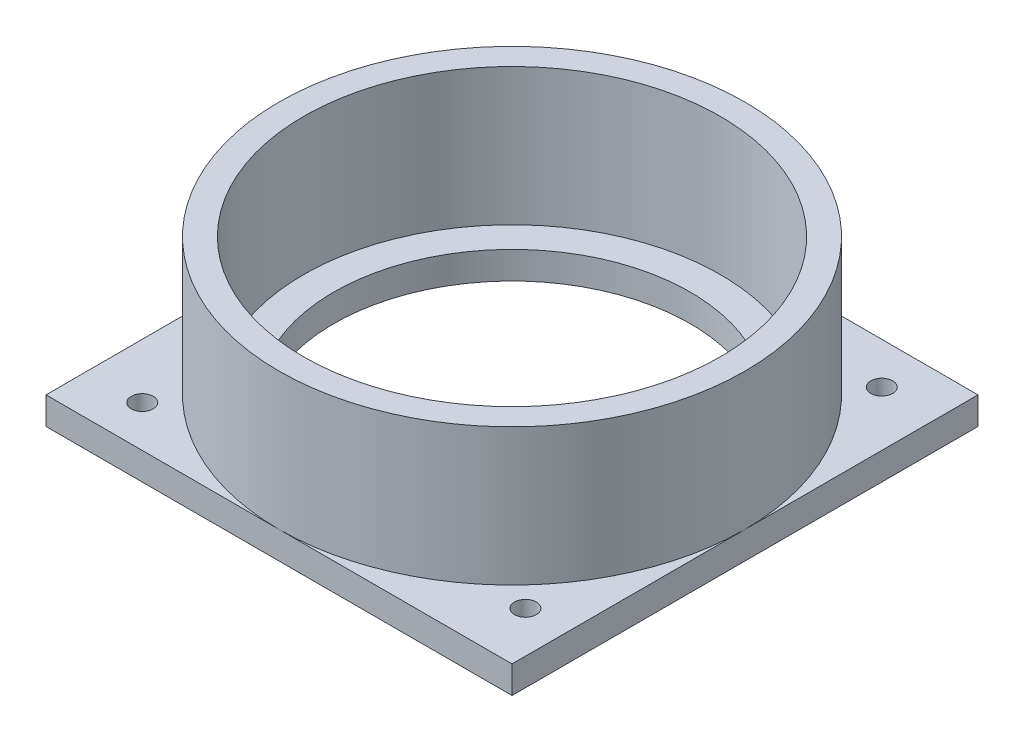
ISO-10303-21;
HEADER;
FILE_DESCRIPTION(('STEP AP214'),'2;1');
FILE_NAME('part.step','',(''),(''),'','','');
FILE_SCHEMA(('AUTOMOTIVE_DESIGN { 1 0 10303 214 1 1 1 1 }'));
ENDSEC;
DATA;
#1=APPLICATION_CONTEXT('core data for automotive mechanical design processes');
#2=APPLICATION_PROTOCOL_DEFINITION('international standard','automotive_design',2000,#1);
#3=PRODUCT_CONTEXT('',#1,'mechanical');
#4=PRODUCT('Part','Part','',(#3));
#5=PRODUCT_RELATED_PRODUCT_CATEGORY('part','',(#4));
#6=PRODUCT_DEFINITION_FORMATION('','',#4);
#7=PRODUCT_DEFINITION_CONTEXT('part definition',#1,'design');
#8=PRODUCT_DEFINITION('design','',#6,#7);
#9=PRODUCT_DEFINITION_SHAPE('','',#8);
#10=(LENGTH_UNIT() NAMED_UNIT(*) SI_UNIT(.MILLI.,.METRE.));
#11=(NAMED_UNIT(*) PLANE_ANGLE_UNIT() SI_UNIT($,.RADIAN.));
#12=(NAMED_UNIT(*) SI_UNIT($,.STERADIAN.) SOLID_ANGLE_UNIT());
#13=UNCERTAINTY_MEASURE_WITH_UNIT(LENGTH_MEASURE(1.E-05),#10,'distance_accuracy_value','');
#14=(GEOMETRIC_REPRESENTATION_CONTEXT(3) GLOBAL_UNCERTAINTY_ASSIGNED_CONTEXT((#13)) GLOBAL_UNIT_ASSIGNED_CONTEXT((#10,
#11,#12)) REPRESENTATION_CONTEXT('',''));
#15=CARTESIAN_POINT('',(0.,0.,0.));
#16=DIRECTION('',(0.,0.,1.));
#17=DIRECTION('',(1.,0.,0.));
#18=AXIS2_PLACEMENT_3D('',#15,#16,#17);
#19=CARTESIAN_POINT('',(0.,5.,0.));
#20=DIRECTION('',(0.,1.,0.));
#21=DIRECTION('',(0.,0.,1.));
#22=AXIS2_PLACEMENT_3D('',#19,#20,#21);
#23=PLANE('',#22);
#24=CARTESIAN_POINT('',(34.9430639376307,5.,32.5000000000003));
#25=DIRECTION('',(0.,1.,0.));
#26=DIRECTION('',(0.,0.,1.));
#27=AXIS2_PLACEMENT_3D('',#24,#25,#26);
#28=CIRCLE('',#27,2.00000000000173);
#29=CARTESIAN_POINT('',(34.9430639376307,5.,34.500000000002));
#30=VERTEX_POINT('',#29);
#31=EDGE_CURVE('E167',#30,#30,#28,.T.);
#32=ORIENTED_EDGE('',*,*,#31,.F.);
#33=EDGE_LOOP('',(#32));
#34=FACE_BOUND('',#33,.T.);
#35=CARTESIAN_POINT('',(0.,5.,0.));
#36=DIRECTION('',(0.,1.,0.));
#37=DIRECTION('',(0.,0.,1.));
#38=AXIS2_PLACEMENT_3D('',#35,#36,#37);
#39=CIRCLE('',#38,42.5);
#40=CARTESIAN_POINT('',(0.,5.,42.5));
#41=VERTEX_POINT('',#40);
#42=CARTESIAN_POINT('',(42.5,5.,0.));
#43=VERTEX_POINT('',#42);
#44=EDGE_CURVE('E44',#41,#43,#39,.T.);
#45=ORIENTED_EDGE('',*,*,#44,.F.);
#46=DIRECTION('',(1.,0.,0.));
#47=VECTOR('',#46,1.);
#48=CARTESIAN_POINT('',(-42.5,5.,42.5));
#49=LINE('',#48,#47);
#50=CARTESIAN_POINT('',(42.5,5.,42.5));
#51=VERTEX_POINT('',#50);
#52=EDGE_CURVE('E95',#41,#51,#49,.T.);
#53=ORIENTED_EDGE('',*,*,#52,.T.);
#54=DIRECTION('',(0.,0.,-1.));
#55=VECTOR('',#54,1.);
#56=CARTESIAN_POINT('',(42.5,5.,-42.5));
#57=LINE('',#56,#55);
#58=EDGE_CURVE('E106',#51,#43,#57,.T.);
#59=ORIENTED_EDGE('',*,*,#58,.T.);
#60=EDGE_LOOP('',(#45,#53,#59));
#61=FACE_BOUND('',#60,.T.);
#62=ADVANCED_FACE('F33',(#34,#61),#23,.T.);
#63=CARTESIAN_POINT('',(32.5000000000022,5.,-34.9430639376308));
#64=DIRECTION('',(0.,1.,0.));
#65=DIRECTION('',(0.,0.,1.));
#66=AXIS2_PLACEMENT_3D('',#63,#64,#65);
#67=CIRCLE('',#66,2.00000000000105);
#68=CARTESIAN_POINT('',(32.5000000000022,5.,-32.9430639376298));
#69=VERTEX_POINT('',#68);
#70=EDGE_CURVE('E149',#69,#69,#67,.T.);
#71=ORIENTED_EDGE('',*,*,#70,.F.);
#72=EDGE_LOOP('',(#71));
#73=FACE_BOUND('',#72,.T.);
#74=CARTESIAN_POINT('',(0.,5.,-42.5));
#75=VERTEX_POINT('',#74);
#76=EDGE_CURVE('E11',#43,#75,#39,.T.);
#77=ORIENTED_EDGE('',*,*,#76,.F.);
#78=CARTESIAN_POINT('',(42.5,5.,-42.5));
#79=VERTEX_POINT('',#78);
#80=EDGE_CURVE('E127',#43,#79,#57,.T.);
#81=ORIENTED_EDGE('',*,*,#80,.T.);
#82=DIRECTION('',(-1.,0.,0.));
#83=VECTOR('',#82,1.);
#84=CARTESIAN_POINT('',(-42.5,5.,-42.5));
#85=LINE('',#84,#83);
#86=EDGE_CURVE('E128',#79,#75,#85,.T.);
#87=ORIENTED_EDGE('',*,*,#86,.T.);
#88=EDGE_LOOP('',(#77,#81,#87));
#89=FACE_BOUND('',#88,.T.);
#90=ADVANCED_FACE('F194',(#73,#89),#23,.T.);
#91=CARTESIAN_POINT('',(-34.9430639376289,5.,-32.5000000000023));
#92=DIRECTION('',(0.,1.,0.));
#93=DIRECTION('',(0.,0.,1.));
#94=AXIS2_PLACEMENT_3D('',#91,#92,#93);
#95=CIRCLE('',#94,1.99999999999906);
#96=CARTESIAN_POINT('',(-34.9430639376289,5.,-30.5000000000032));
#97=VERTEX_POINT('',#96);
#98=EDGE_CURVE('E168',#97,#97,#95,.T.);
#99=ORIENTED_EDGE('',*,*,#98,.F.);
#100=EDGE_LOOP('',(#99));
#101=FACE_BOUND('',#100,.T.);
#102=CARTESIAN_POINT('',(-42.5,5.,0.));
#103=VERTEX_POINT('',#102);
#104=EDGE_CURVE('E42',#75,#103,#39,.T.);
#105=ORIENTED_EDGE('',*,*,#104,.F.);
#106=CARTESIAN_POINT('',(-42.5,5.,-42.5));
#107=VERTEX_POINT('',#106);
#108=EDGE_CURVE('E126',#75,#107,#85,.T.);
#109=ORIENTED_EDGE('',*,*,#108,.T.);
#110=DIRECTION('',(0.,0.,1.));
#111=VECTOR('',#110,1.);
#112=CARTESIAN_POINT('',(-42.5,5.,-42.5));
#113=LINE('',#112,#111);
#114=EDGE_CURVE('E104',#107,#103,#113,.T.);
#115=ORIENTED_EDGE('',*,*,#114,.T.);
#116=EDGE_LOOP('',(#105,#109,#115));
#117=FACE_BOUND('',#116,.T.);
#118=ADVANCED_FACE('F197',(#101,#117),#23,.T.);
#119=CARTESIAN_POINT('',(0.,5.,0.));
#120=DIRECTION('',(0.,1.,0.));
#121=DIRECTION('',(0.,0.,1.));
#122=AXIS2_PLACEMENT_3D('',#119,#120,#121);
#123=CIRCLE('',#122,32.5);
#124=CARTESIAN_POINT('',(0.,5.,32.5));
#125=VERTEX_POINT('',#124);
#126=EDGE_CURVE('E122',#125,#125,#123,.T.);
#127=ORIENTED_EDGE('',*,*,#126,.F.);
#128=EDGE_LOOP('',(#127));
#129=FACE_BOUND('',#128,.T.);
#130=CARTESIAN_POINT('',(0.,5.,0.));
#131=DIRECTION('',(0.,1.,0.));
#132=DIRECTION('',(0.,0.,1.));
#133=AXIS2_PLACEMENT_3D('',#130,#131,#132);
#134=CIRCLE('',#133,38.);
#135=CARTESIAN_POINT('',(0.,5.,38.));
#136=VERTEX_POINT('',#135);
#137=EDGE_CURVE('E156',#136,#136,#134,.T.);
#138=ORIENTED_EDGE('',*,*,#137,.T.);
#139=EDGE_LOOP('',(#138));
#140=FACE_BOUND('',#139,.T.);
#141=ADVANCED_FACE('F183',(#129,#140),#23,.T.);
#142=CARTESIAN_POINT('',(42.5,5.,-42.5));
#143=DIRECTION('',(-1.,0.,0.));
#144=DIRECTION('',(0.,0.,1.));
#145=AXIS2_PLACEMENT_3D('',#142,#143,#144);
#146=PLANE('',#145);
#147=DIRECTION('',(0.,0.,-1.));
#148=VECTOR('',#147,1.);
#149=CARTESIAN_POINT('',(42.5,0.,-42.5));
#150=LINE('',#149,#148);
#151=CARTESIAN_POINT('',(42.5,0.,42.5));
#152=VERTEX_POINT('',#151);
#153=CARTESIAN_POINT('',(42.5,0.,-42.5));
#154=VERTEX_POINT('',#153);
#155=EDGE_CURVE('E121',#152,#154,#150,.T.);
#156=ORIENTED_EDGE('',*,*,#155,.T.);
#157=DIRECTION('',(0.,-1.,0.));
#158=VECTOR('',#157,1.);
#159=CARTESIAN_POINT('',(42.5,5.,-42.5));
#160=LINE('',#159,#158);
#161=EDGE_CURVE('E111',#79,#154,#160,.T.);
#162=ORIENTED_EDGE('',*,*,#161,.F.);
#163=ORIENTED_EDGE('',*,*,#80,.F.);
#164=ORIENTED_EDGE('',*,*,#58,.F.);
#165=DIRECTION('',(0.,-1.,0.));
#166=VECTOR('',#165,1.);
#167=CARTESIAN_POINT('',(42.5,5.,42.5));
#168=LINE('',#167,#166);
#169=EDGE_CURVE('E94',#51,#152,#168,.T.);
#170=ORIENTED_EDGE('',*,*,#169,.T.);
#171=EDGE_LOOP('',(#156,#162,#163,#164,#170));
#172=FACE_BOUND('',#171,.T.);
#173=ADVANCED_FACE('F35',(#172),#146,.F.);
#174=CARTESIAN_POINT('',(-42.5,5.,-42.5));
#175=DIRECTION('',(0.,0.,1.));
#176=DIRECTION('',(1.,0.,0.));
#177=AXIS2_PLACEMENT_3D('',#174,#175,#176);
#178=PLANE('',#177);
#179=DIRECTION('',(-1.,0.,0.));
#180=VECTOR('',#179,1.);
#181=CARTESIAN_POINT('',(-42.5,0.,-42.5));
#182=LINE('',#181,#180);
#183=CARTESIAN_POINT('',(-42.5,0.,-42.5));
#184=VERTEX_POINT('',#183);
#185=EDGE_CURVE('E134',#154,#184,#182,.T.);
#186=ORIENTED_EDGE('',*,*,#185,.T.);
#187=DIRECTION('',(0.,-1.,0.));
#188=VECTOR('',#187,1.);
#189=CARTESIAN_POINT('',(-42.5,5.,-42.5));
#190=LINE('',#189,#188);
#191=EDGE_CURVE('E113',#107,#184,#190,.T.);
#192=ORIENTED_EDGE('',*,*,#191,.F.);
#193=ORIENTED_EDGE('',*,*,#108,.F.);
#194=ORIENTED_EDGE('',*,*,#86,.F.);
#195=ORIENTED_EDGE('',*,*,#161,.T.);
#196=EDGE_LOOP('',(#186,#192,#193,#194,#195));
#197=FACE_BOUND('',#196,.T.);
#198=ADVANCED_FACE('F203',(#197),#178,.F.);
#199=CARTESIAN_POINT('',(-42.5,5.,-42.5));
#200=DIRECTION('',(1.,0.,0.));
#201=DIRECTION('',(0.,0.,-1.));
#202=AXIS2_PLACEMENT_3D('',#199,#200,#201);
#203=PLANE('',#202);
#204=DIRECTION('',(0.,0.,1.));
#205=VECTOR('',#204,1.);
#206=CARTESIAN_POINT('',(-42.5,0.,-42.5));
#207=LINE('',#206,#205);
#208=CARTESIAN_POINT('',(-42.5,0.,42.5));
#209=VERTEX_POINT('',#208);
#210=EDGE_CURVE('E136',#184,#209,#207,.T.);
#211=ORIENTED_EDGE('',*,*,#210,.T.);
#212=DIRECTION('',(0.,-1.,0.));
#213=VECTOR('',#212,1.);
#214=CARTESIAN_POINT('',(-42.5,5.,42.5));
#215=LINE('',#214,#213);
#216=CARTESIAN_POINT('',(-42.5,5.,42.5));
#217=VERTEX_POINT('',#216);
#218=EDGE_CURVE('E141',#217,#209,#215,.T.);
#219=ORIENTED_EDGE('',*,*,#218,.F.);
#220=EDGE_CURVE('E90',#103,#217,#113,.T.);
#221=ORIENTED_EDGE('',*,*,#220,.F.);
#222=ORIENTED_EDGE('',*,*,#114,.F.);
#223=ORIENTED_EDGE('',*,*,#191,.T.);
#224=EDGE_LOOP('',(#211,#219,#221,#222,#223));
#225=FACE_BOUND('',#224,.T.);
#226=ADVANCED_FACE('F190',(#225),#203,.F.);
#227=CARTESIAN_POINT('',(-42.5,5.,42.5));
#228=DIRECTION('',(0.,0.,-1.));
#229=DIRECTION('',(-1.,0.,0.));
#230=AXIS2_PLACEMENT_3D('',#227,#228,#229);
#231=PLANE('',#230);
#232=DIRECTION('',(1.,0.,0.));
#233=VECTOR('',#232,1.);
#234=CARTESIAN_POINT('',(-42.5,0.,42.5));
#235=LINE('',#234,#233);
#236=EDGE_CURVE('E138',#209,#152,#235,.T.);
#237=ORIENTED_EDGE('',*,*,#236,.T.);
#238=ORIENTED_EDGE('',*,*,#169,.F.);
#239=ORIENTED_EDGE('',*,*,#52,.F.);
#240=EDGE_CURVE('E87',#217,#41,#49,.T.);
#241=ORIENTED_EDGE('',*,*,#240,.F.);
#242=ORIENTED_EDGE('',*,*,#218,.T.);
#243=EDGE_LOOP('',(#237,#238,#239,#241,#242));
#244=FACE_BOUND('',#243,.T.);
#245=ADVANCED_FACE('F99',(#244),#231,.F.);
#246=CARTESIAN_POINT('',(-32.5000000000004,5.,34.9430639376288));
#247=DIRECTION('',(0.,1.,0.));
#248=DIRECTION('',(0.,0.,1.));
#249=AXIS2_PLACEMENT_3D('',#246,#247,#248);
#250=CIRCLE('',#249,2.);
#251=CARTESIAN_POINT('',(-32.5000000000004,5.,36.9430639376288));
#252=VERTEX_POINT('',#251);
#253=EDGE_CURVE('E171',#252,#252,#250,.T.);
#254=ORIENTED_EDGE('',*,*,#253,.F.);
#255=EDGE_LOOP('',(#254));
#256=FACE_BOUND('',#255,.T.);
#257=EDGE_CURVE('E51',#103,#41,#39,.T.);
#258=ORIENTED_EDGE('',*,*,#257,.F.);
#259=ORIENTED_EDGE('',*,*,#220,.T.);
#260=ORIENTED_EDGE('',*,*,#240,.T.);
#261=EDGE_LOOP('',(#258,#259,#260));
#262=FACE_BOUND('',#261,.T.);
#263=ADVANCED_FACE('F89',(#256,#262),#23,.T.);
#264=CARTESIAN_POINT('',(0.,0.,0.));
#265=DIRECTION('',(0.,1.,0.));
#266=DIRECTION('',(0.,0.,1.));
#267=AXIS2_PLACEMENT_3D('',#264,#265,#266);
#268=PLANE('',#267);
#269=CARTESIAN_POINT('',(34.9430639376307,0.,32.5000000000003));
#270=DIRECTION('',(0.,1.,0.));
#271=DIRECTION('',(0.,0.,1.));
#272=AXIS2_PLACEMENT_3D('',#269,#270,#271);
#273=CIRCLE('',#272,2.00000000000173);
#274=CARTESIAN_POINT('',(34.9430639376307,0.,34.500000000002));
#275=VERTEX_POINT('',#274);
#276=EDGE_CURVE('E37',#275,#275,#273,.T.);
#277=ORIENTED_EDGE('',*,*,#276,.T.);
#278=EDGE_LOOP('',(#277));
#279=FACE_BOUND('',#278,.T.);
#280=CARTESIAN_POINT('',(-34.9430639376289,0.,-32.5000000000023));
#281=DIRECTION('',(0.,1.,0.));
#282=DIRECTION('',(0.,0.,1.));
#283=AXIS2_PLACEMENT_3D('',#280,#281,#282);
#284=CIRCLE('',#283,1.99999999999906);
#285=CARTESIAN_POINT('',(-34.9430639376289,0.,-30.5000000000032));
#286=VERTEX_POINT('',#285);
#287=EDGE_CURVE('E151',#286,#286,#284,.T.);
#288=ORIENTED_EDGE('',*,*,#287,.T.);
#289=EDGE_LOOP('',(#288));
#290=FACE_BOUND('',#289,.T.);
#291=CARTESIAN_POINT('',(-32.5000000000004,0.,34.9430639376288));
#292=DIRECTION('',(0.,1.,0.));
#293=DIRECTION('',(0.,0.,1.));
#294=AXIS2_PLACEMENT_3D('',#291,#292,#293);
#295=CIRCLE('',#294,2.);
#296=CARTESIAN_POINT('',(-32.5000000000004,0.,36.9430639376288));
#297=VERTEX_POINT('',#296);
#298=EDGE_CURVE('E148',#297,#297,#295,.T.);
#299=ORIENTED_EDGE('',*,*,#298,.T.);
#300=EDGE_LOOP('',(#299));
#301=FACE_BOUND('',#300,.T.);
#302=CARTESIAN_POINT('',(32.5000000000022,0.,-34.9430639376308));
#303=DIRECTION('',(0.,1.,0.));
#304=DIRECTION('',(0.,0.,1.));
#305=AXIS2_PLACEMENT_3D('',#302,#303,#304);
#306=CIRCLE('',#305,2.00000000000105);
#307=CARTESIAN_POINT('',(32.5000000000022,0.,-32.9430639376298));
#308=VERTEX_POINT('',#307);
#309=EDGE_CURVE('E145',#308,#308,#306,.T.);
#310=ORIENTED_EDGE('',*,*,#309,.T.);
#311=EDGE_LOOP('',(#310));
#312=FACE_BOUND('',#311,.T.);
#313=CARTESIAN_POINT('',(0.,0.,0.));
#314=DIRECTION('',(0.,1.,0.));
#315=DIRECTION('',(0.,0.,1.));
#316=AXIS2_PLACEMENT_3D('',#313,#314,#315);
#317=CIRCLE('',#316,32.5);
#318=CARTESIAN_POINT('',(0.,0.,32.5));
#319=VERTEX_POINT('',#318);
#320=EDGE_CURVE('E118',#319,#319,#317,.T.);
#321=ORIENTED_EDGE('',*,*,#320,.T.);
#322=EDGE_LOOP('',(#321));
#323=FACE_BOUND('',#322,.T.);
#324=ORIENTED_EDGE('',*,*,#155,.F.);
#325=ORIENTED_EDGE('',*,*,#236,.F.);
#326=ORIENTED_EDGE('',*,*,#210,.F.);
#327=ORIENTED_EDGE('',*,*,#185,.F.);
#328=EDGE_LOOP('',(#324,#325,#326,#327));
#329=FACE_BOUND('',#328,.T.);
#330=ADVANCED_FACE('F181',(#279,#290,#301,#312,#323,#329),#268,.F.);
#331=CARTESIAN_POINT('',(0.,0.,0.));
#332=DIRECTION('',(0.,1.,0.));
#333=DIRECTION('',(0.,0.,1.));
#334=AXIS2_PLACEMENT_3D('',#331,#332,#333);
#335=CYLINDRICAL_SURFACE('',#334,32.5);
#336=ORIENTED_EDGE('',*,*,#320,.F.);
#337=EDGE_LOOP('',(#336));
#338=FACE_BOUND('',#337,.T.);
#339=ORIENTED_EDGE('',*,*,#126,.T.);
#340=EDGE_LOOP('',(#339));
#341=FACE_BOUND('',#340,.T.);
#342=ADVANCED_FACE('F188',(#338,#341),#335,.F.);
#343=CARTESIAN_POINT('',(0.,30.,0.));
#344=DIRECTION('',(0.,1.,0.));
#345=DIRECTION('',(0.,0.,1.));
#346=AXIS2_PLACEMENT_3D('',#343,#344,#345);
#347=PLANE('',#346);
#348=CARTESIAN_POINT('',(0.,30.,0.));
#349=DIRECTION('',(0.,1.,0.));
#350=DIRECTION('',(0.,0.,1.));
#351=AXIS2_PLACEMENT_3D('',#348,#349,#350);
#352=CIRCLE('',#351,42.5);
#353=CARTESIAN_POINT('',(0.,30.,42.5));
#354=VERTEX_POINT('',#353);
#355=EDGE_CURVE('E108',#354,#354,#352,.T.);
#356=ORIENTED_EDGE('',*,*,#355,.T.);
#357=EDGE_LOOP('',(#356));
#358=FACE_BOUND('',#357,.T.);
#359=CARTESIAN_POINT('',(0.,30.,0.));
#360=DIRECTION('',(0.,1.,0.));
#361=DIRECTION('',(0.,0.,1.));
#362=AXIS2_PLACEMENT_3D('',#359,#360,#361);
#363=CIRCLE('',#362,38.);
#364=CARTESIAN_POINT('',(0.,30.,38.));
#365=VERTEX_POINT('',#364);
#366=EDGE_CURVE('E109',#365,#365,#363,.T.);
#367=ORIENTED_EDGE('',*,*,#366,.F.);
#368=EDGE_LOOP('',(#367));
#369=FACE_BOUND('',#368,.T.);
#370=ADVANCED_FACE('F209',(#358,#369),#347,.T.);
#371=CARTESIAN_POINT('',(0.,30.,0.));
#372=DIRECTION('',(0.,-1.,0.));
#373=DIRECTION('',(0.,0.,-1.));
#374=AXIS2_PLACEMENT_3D('',#371,#372,#373);
#375=CYLINDRICAL_SURFACE('',#374,42.5);
#376=ORIENTED_EDGE('',*,*,#355,.F.);
#377=EDGE_LOOP('',(#376));
#378=FACE_BOUND('',#377,.T.);
#379=ORIENTED_EDGE('',*,*,#44,.T.);
#380=ORIENTED_EDGE('',*,*,#76,.T.);
#381=ORIENTED_EDGE('',*,*,#104,.T.);
#382=ORIENTED_EDGE('',*,*,#257,.T.);
#383=EDGE_LOOP('',(#379,#380,#381,#382));
#384=FACE_BOUND('',#383,.T.);
#385=ADVANCED_FACE('F110',(#378,#384),#375,.T.);
#386=CARTESIAN_POINT('',(0.,30.,0.));
#387=DIRECTION('',(0.,-1.,0.));
#388=DIRECTION('',(0.,0.,-1.));
#389=AXIS2_PLACEMENT_3D('',#386,#387,#388);
#390=CYLINDRICAL_SURFACE('',#389,38.);
#391=ORIENTED_EDGE('',*,*,#366,.T.);
#392=EDGE_LOOP('',(#391));
#393=FACE_BOUND('',#392,.T.);
#394=ORIENTED_EDGE('',*,*,#137,.F.);
#395=EDGE_LOOP('',(#394));
#396=FACE_BOUND('',#395,.T.);
#397=ADVANCED_FACE('F219',(#393,#396),#390,.F.);
#398=CARTESIAN_POINT('',(32.5000000000022,-20.,-34.9430639376308));
#399=DIRECTION('',(0.,1.,0.));
#400=DIRECTION('',(0.,0.,1.));
#401=AXIS2_PLACEMENT_3D('',#398,#399,#400);
#402=CYLINDRICAL_SURFACE('',#401,2.00000000000105);
#403=ORIENTED_EDGE('',*,*,#70,.T.);
#404=EDGE_LOOP('',(#403));
#405=FACE_BOUND('',#404,.T.);
#406=ORIENTED_EDGE('',*,*,#309,.F.);
#407=EDGE_LOOP('',(#406));
#408=FACE_BOUND('',#407,.T.);
#409=ADVANCED_FACE('F224',(#405,#408),#402,.F.);
#410=CARTESIAN_POINT('',(-32.5000000000004,-20.,34.9430639376288));
#411=DIRECTION('',(0.,1.,0.));
#412=DIRECTION('',(0.,0.,1.));
#413=AXIS2_PLACEMENT_3D('',#410,#411,#412);
#414=CYLINDRICAL_SURFACE('',#413,2.);
#415=ORIENTED_EDGE('',*,*,#253,.T.);
#416=EDGE_LOOP('',(#415));
#417=FACE_BOUND('',#416,.T.);
#418=ORIENTED_EDGE('',*,*,#298,.F.);
#419=EDGE_LOOP('',(#418));
#420=FACE_BOUND('',#419,.T.);
#421=ADVANCED_FACE('F177',(#417,#420),#414,.F.);
#422=CARTESIAN_POINT('',(-34.9430639376289,-20.,-32.5000000000023));
#423=DIRECTION('',(0.,1.,0.));
#424=DIRECTION('',(0.,0.,1.));
#425=AXIS2_PLACEMENT_3D('',#422,#423,#424);
#426=CYLINDRICAL_SURFACE('',#425,1.99999999999906);
#427=ORIENTED_EDGE('',*,*,#98,.T.);
#428=EDGE_LOOP('',(#427));
#429=FACE_BOUND('',#428,.T.);
#430=ORIENTED_EDGE('',*,*,#287,.F.);
#431=EDGE_LOOP('',(#430));
#432=FACE_BOUND('',#431,.T.);
#433=ADVANCED_FACE('F229',(#429,#432),#426,.F.);
#434=CARTESIAN_POINT('',(34.9430639376307,-20.,32.5000000000003));
#435=DIRECTION('',(0.,1.,0.));
#436=DIRECTION('',(0.,0.,1.));
#437=AXIS2_PLACEMENT_3D('',#434,#435,#436);
#438=CYLINDRICAL_SURFACE('',#437,2.00000000000173);
#439=ORIENTED_EDGE('',*,*,#31,.T.);
#440=EDGE_LOOP('',(#439));
#441=FACE_BOUND('',#440,.T.);
#442=ORIENTED_EDGE('',*,*,#276,.F.);
#443=EDGE_LOOP('',(#442));
#444=FACE_BOUND('',#443,.T.);
#445=ADVANCED_FACE('F232',(#441,#444),#438,.F.);
#446=CLOSED_SHELL('',(#62,#90,#118,#141,#173,#198,#226,#245,#263,#330,#342,#370,#385,#397,#409,
#421,#433,#445));
#447=MANIFOLD_SOLID_BREP('B2',#446);
#448=ADVANCED_BREP_SHAPE_REPRESENTATION('',(#18,#447),#14);
#449=SHAPE_DEFINITION_REPRESENTATION(#9,#448);
ENDSEC;
END-ISO-10303-21;
